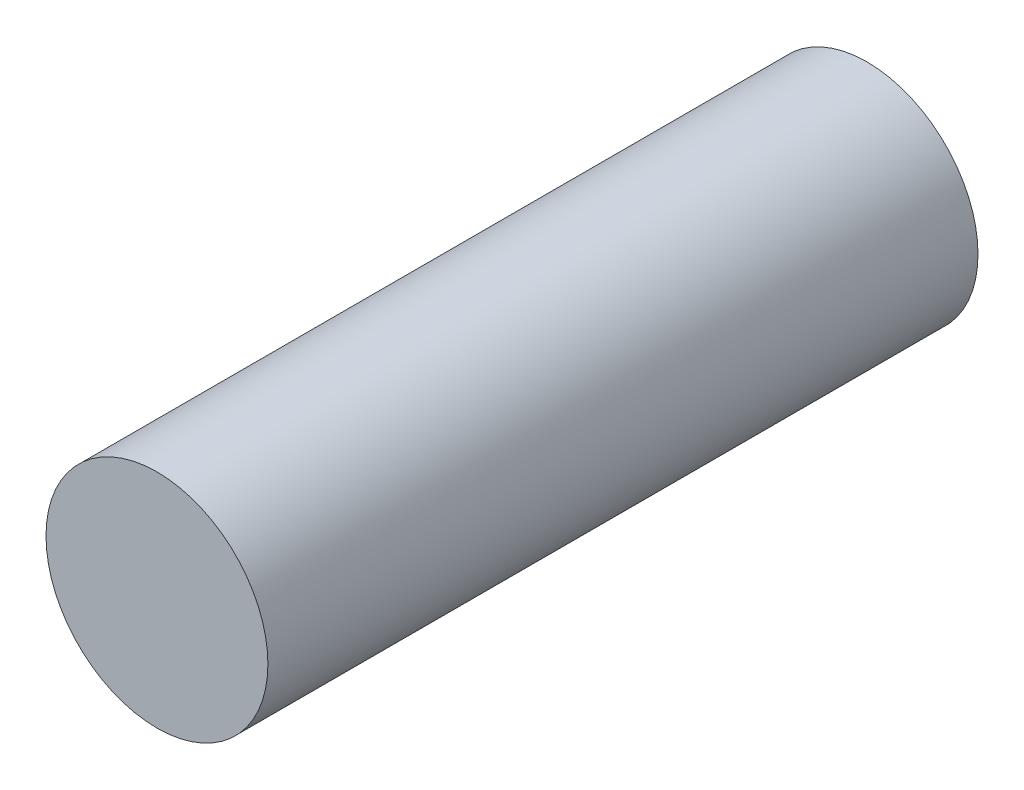
ISO-10303-21;
HEADER;
FILE_DESCRIPTION(('STEP AP214'),'2;1');
FILE_NAME('part.step','',(''),(''),'','','');
FILE_SCHEMA(('AUTOMOTIVE_DESIGN { 1 0 10303 214 1 1 1 1 }'));
ENDSEC;
DATA;
#1=APPLICATION_CONTEXT('core data for automotive mechanical design processes');
#2=APPLICATION_PROTOCOL_DEFINITION('international standard','automotive_design',2000,#1);
#3=PRODUCT_CONTEXT('',#1,'mechanical');
#4=PRODUCT('Part','Part','',(#3));
#5=PRODUCT_RELATED_PRODUCT_CATEGORY('part','',(#4));
#6=PRODUCT_DEFINITION_FORMATION('','',#4);
#7=PRODUCT_DEFINITION_CONTEXT('part definition',#1,'design');
#8=PRODUCT_DEFINITION('design','',#6,#7);
#9=PRODUCT_DEFINITION_SHAPE('','',#8);
#10=(LENGTH_UNIT() NAMED_UNIT(*) SI_UNIT(.MILLI.,.METRE.));
#11=(NAMED_UNIT(*) PLANE_ANGLE_UNIT() SI_UNIT($,.RADIAN.));
#12=(NAMED_UNIT(*) SI_UNIT($,.STERADIAN.) SOLID_ANGLE_UNIT());
#13=UNCERTAINTY_MEASURE_WITH_UNIT(LENGTH_MEASURE(1.E-05),#10,'distance_accuracy_value','');
#14=(GEOMETRIC_REPRESENTATION_CONTEXT(3) GLOBAL_UNCERTAINTY_ASSIGNED_CONTEXT((#13)) GLOBAL_UNIT_ASSIGNED_CONTEXT((#10,
#11,#12)) REPRESENTATION_CONTEXT('',''));
#15=CARTESIAN_POINT('',(0.,0.,0.));
#16=DIRECTION('',(0.,0.,1.));
#17=DIRECTION('',(1.,0.,0.));
#18=AXIS2_PLACEMENT_3D('',#15,#16,#17);
#19=CARTESIAN_POINT('',(0.,0.,80.));
#20=DIRECTION('',(0.,0.,-1.));
#21=DIRECTION('',(-1.,0.,0.));
#22=AXIS2_PLACEMENT_3D('',#19,#20,#21);
#23=CYLINDRICAL_SURFACE('',#22,12.5);
#24=CARTESIAN_POINT('',(0.,0.,80.));
#25=DIRECTION('',(0.,0.,1.));
#26=DIRECTION('',(1.,0.,0.));
#27=AXIS2_PLACEMENT_3D('',#24,#25,#26);
#28=CIRCLE('',#27,12.5);
#29=CARTESIAN_POINT('',(12.5,0.,80.));
#30=VERTEX_POINT('',#29);
#31=EDGE_CURVE('E10',#30,#30,#28,.T.);
#32=ORIENTED_EDGE('',*,*,#31,.F.);
#33=EDGE_LOOP('',(#32));
#34=FACE_BOUND('',#33,.T.);
#35=CARTESIAN_POINT('',(0.,0.,0.));
#36=DIRECTION('',(0.,0.,1.));
#37=DIRECTION('',(1.,0.,0.));
#38=AXIS2_PLACEMENT_3D('',#35,#36,#37);
#39=CIRCLE('',#38,12.5);
#40=CARTESIAN_POINT('',(12.5,0.,0.));
#41=VERTEX_POINT('',#40);
#42=EDGE_CURVE('E34',#41,#41,#39,.T.);
#43=ORIENTED_EDGE('',*,*,#42,.T.);
#44=EDGE_LOOP('',(#43));
#45=FACE_BOUND('',#44,.T.);
#46=ADVANCED_FACE('F31',(#34,#45),#23,.T.);
#47=CARTESIAN_POINT('',(0.,0.,80.));
#48=DIRECTION('',(0.,0.,1.));
#49=DIRECTION('',(1.,0.,0.));
#50=AXIS2_PLACEMENT_3D('',#47,#48,#49);
#51=PLANE('',#50);
#52=ORIENTED_EDGE('',*,*,#31,.T.);
#53=EDGE_LOOP('',(#52));
#54=FACE_BOUND('',#53,.T.);
#55=ADVANCED_FACE('F46',(#54),#51,.T.);
#56=CARTESIAN_POINT('',(0.,0.,0.));
#57=DIRECTION('',(0.,0.,1.));
#58=DIRECTION('',(1.,0.,0.));
#59=AXIS2_PLACEMENT_3D('',#56,#57,#58);
#60=PLANE('',#59);
#61=ORIENTED_EDGE('',*,*,#42,.F.);
#62=EDGE_LOOP('',(#61));
#63=FACE_BOUND('',#62,.T.);
#64=ADVANCED_FACE('F44',(#63),#60,.F.);
#65=CLOSED_SHELL('',(#46,#55,#64));
#66=MANIFOLD_SOLID_BREP('B2',#65);
#67=ADVANCED_BREP_SHAPE_REPRESENTATION('',(#18,#66),#14);
#68=SHAPE_DEFINITION_REPRESENTATION(#9,#67);
ENDSEC;
END-ISO-10303-21;
